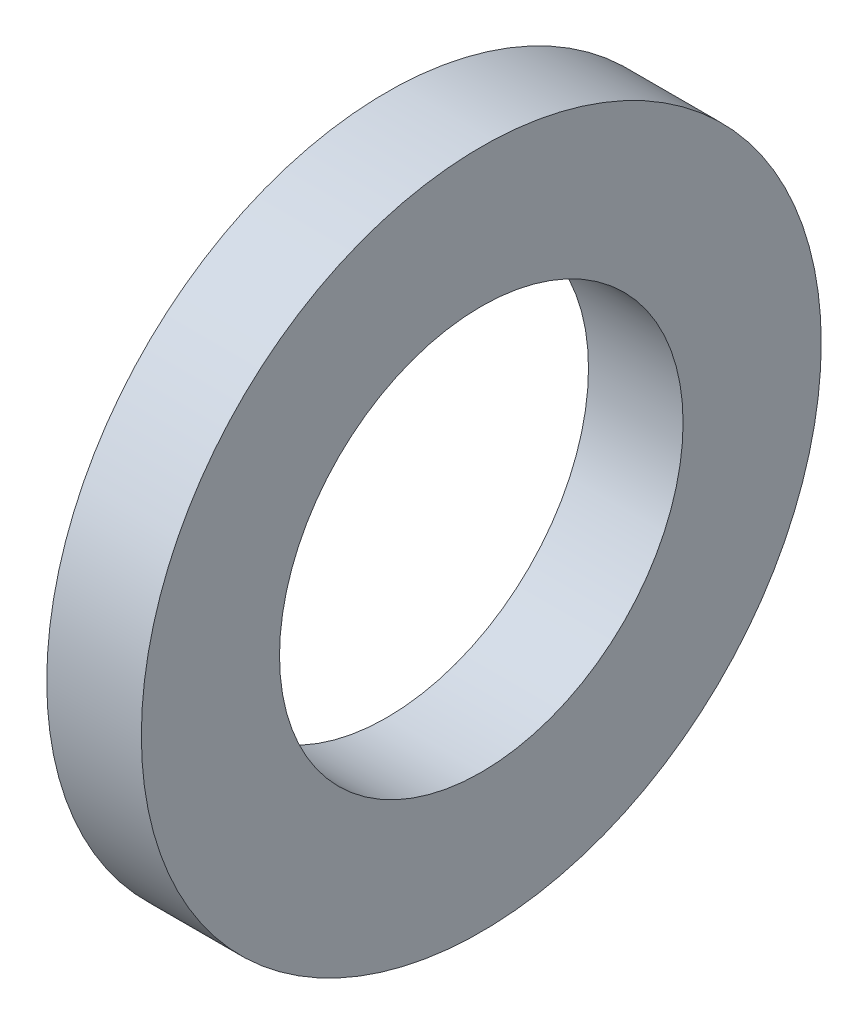
ISO-10303-21;
HEADER;
FILE_DESCRIPTION(('STEP AP214'),'2;1');
FILE_NAME('part.step','',(''),(''),'','','');
FILE_SCHEMA(('AUTOMOTIVE_DESIGN { 1 0 10303 214 1 1 1 1 }'));
ENDSEC;
DATA;
#1=APPLICATION_CONTEXT('core data for automotive mechanical design processes');
#2=APPLICATION_PROTOCOL_DEFINITION('international standard','automotive_design',2000,#1);
#3=PRODUCT_CONTEXT('',#1,'mechanical');
#4=PRODUCT('Part','Part','',(#3));
#5=PRODUCT_RELATED_PRODUCT_CATEGORY('part','',(#4));
#6=PRODUCT_DEFINITION_FORMATION('','',#4);
#7=PRODUCT_DEFINITION_CONTEXT('part definition',#1,'design');
#8=PRODUCT_DEFINITION('design','',#6,#7);
#9=PRODUCT_DEFINITION_SHAPE('','',#8);
#10=(LENGTH_UNIT() NAMED_UNIT(*) SI_UNIT(.MILLI.,.METRE.));
#11=(NAMED_UNIT(*) PLANE_ANGLE_UNIT() SI_UNIT($,.RADIAN.));
#12=(NAMED_UNIT(*) SI_UNIT($,.STERADIAN.) SOLID_ANGLE_UNIT());
#13=UNCERTAINTY_MEASURE_WITH_UNIT(LENGTH_MEASURE(1.E-05),#10,'distance_accuracy_value','');
#14=(GEOMETRIC_REPRESENTATION_CONTEXT(3) GLOBAL_UNCERTAINTY_ASSIGNED_CONTEXT((#13)) GLOBAL_UNIT_ASSIGNED_CONTEXT((#10,
#11,#12)) REPRESENTATION_CONTEXT('',''));
#15=CARTESIAN_POINT('',(0.,0.,0.));
#16=DIRECTION('',(0.,0.,1.));
#17=DIRECTION('',(1.,0.,0.));
#18=AXIS2_PLACEMENT_3D('',#15,#16,#17);
#19=CARTESIAN_POINT('',(12.8,0.,0.));
#20=DIRECTION('',(1.,0.,0.));
#21=DIRECTION('',(0.,0.,-1.));
#22=AXIS2_PLACEMENT_3D('',#19,#20,#21);
#23=PLANE('',#22);
#24=CARTESIAN_POINT('',(12.8,0.,0.));
#25=DIRECTION('',(1.,0.,0.));
#26=DIRECTION('',(0.,0.,-1.));
#27=AXIS2_PLACEMENT_3D('',#24,#25,#26);
#28=CIRCLE('',#27,46.);
#29=CARTESIAN_POINT('',(12.8,0.,-46.));
#30=VERTEX_POINT('',#29);
#31=EDGE_CURVE('E10',#30,#30,#28,.T.);
#32=ORIENTED_EDGE('',*,*,#31,.T.);
#33=EDGE_LOOP('',(#32));
#34=FACE_BOUND('',#33,.T.);
#35=CARTESIAN_POINT('',(12.8,0.,0.));
#36=DIRECTION('',(1.,0.,0.));
#37=DIRECTION('',(0.,0.,-1.));
#38=AXIS2_PLACEMENT_3D('',#35,#36,#37);
#39=CIRCLE('',#38,27.305);
#40=CARTESIAN_POINT('',(12.8,0.,-27.305));
#41=VERTEX_POINT('',#40);
#42=EDGE_CURVE('E42',#41,#41,#39,.T.);
#43=ORIENTED_EDGE('',*,*,#42,.F.);
#44=EDGE_LOOP('',(#43));
#45=FACE_BOUND('',#44,.T.);
#46=ADVANCED_FACE('F31',(#34,#45),#23,.T.);
#47=CARTESIAN_POINT('',(0.,0.,0.));
#48=DIRECTION('',(1.,0.,0.));
#49=DIRECTION('',(0.,0.,-1.));
#50=AXIS2_PLACEMENT_3D('',#47,#48,#49);
#51=PLANE('',#50);
#52=CARTESIAN_POINT('',(0.,0.,0.));
#53=DIRECTION('',(1.,0.,0.));
#54=DIRECTION('',(0.,0.,-1.));
#55=AXIS2_PLACEMENT_3D('',#52,#53,#54);
#56=CIRCLE('',#55,46.);
#57=CARTESIAN_POINT('',(0.,0.,-46.));
#58=VERTEX_POINT('',#57);
#59=EDGE_CURVE('E35',#58,#58,#56,.T.);
#60=ORIENTED_EDGE('',*,*,#59,.F.);
#61=EDGE_LOOP('',(#60));
#62=FACE_BOUND('',#61,.T.);
#63=CARTESIAN_POINT('',(0.,0.,0.));
#64=DIRECTION('',(1.,0.,0.));
#65=DIRECTION('',(0.,0.,-1.));
#66=AXIS2_PLACEMENT_3D('',#63,#64,#65);
#67=CIRCLE('',#66,27.305);
#68=CARTESIAN_POINT('',(0.,0.,-27.305));
#69=VERTEX_POINT('',#68);
#70=EDGE_CURVE('E44',#69,#69,#67,.T.);
#71=ORIENTED_EDGE('',*,*,#70,.T.);
#72=EDGE_LOOP('',(#71));
#73=FACE_BOUND('',#72,.T.);
#74=ADVANCED_FACE('F54',(#62,#73),#51,.F.);
#75=CARTESIAN_POINT('',(12.8,0.,0.));
#76=DIRECTION('',(-1.,0.,0.));
#77=DIRECTION('',(0.,0.,1.));
#78=AXIS2_PLACEMENT_3D('',#75,#76,#77);
#79=CYLINDRICAL_SURFACE('',#78,46.);
#80=ORIENTED_EDGE('',*,*,#31,.F.);
#81=EDGE_LOOP('',(#80));
#82=FACE_BOUND('',#81,.T.);
#83=ORIENTED_EDGE('',*,*,#59,.T.);
#84=EDGE_LOOP('',(#83));
#85=FACE_BOUND('',#84,.T.);
#86=ADVANCED_FACE('F33',(#82,#85),#79,.T.);
#87=CARTESIAN_POINT('',(12.8,0.,0.));
#88=DIRECTION('',(-1.,0.,0.));
#89=DIRECTION('',(0.,0.,1.));
#90=AXIS2_PLACEMENT_3D('',#87,#88,#89);
#91=CYLINDRICAL_SURFACE('',#90,27.305);
#92=ORIENTED_EDGE('',*,*,#42,.T.);
#93=EDGE_LOOP('',(#92));
#94=FACE_BOUND('',#93,.T.);
#95=ORIENTED_EDGE('',*,*,#70,.F.);
#96=EDGE_LOOP('',(#95));
#97=FACE_BOUND('',#96,.T.);
#98=ADVANCED_FACE('F50',(#94,#97),#91,.F.);
#99=CLOSED_SHELL('',(#46,#74,#86,#98));
#100=MANIFOLD_SOLID_BREP('B2',#99);
#101=ADVANCED_BREP_SHAPE_REPRESENTATION('',(#18,#100),#14);
#102=SHAPE_DEFINITION_REPRESENTATION(#9,#101);
ENDSEC;
END-ISO-10303-21;
